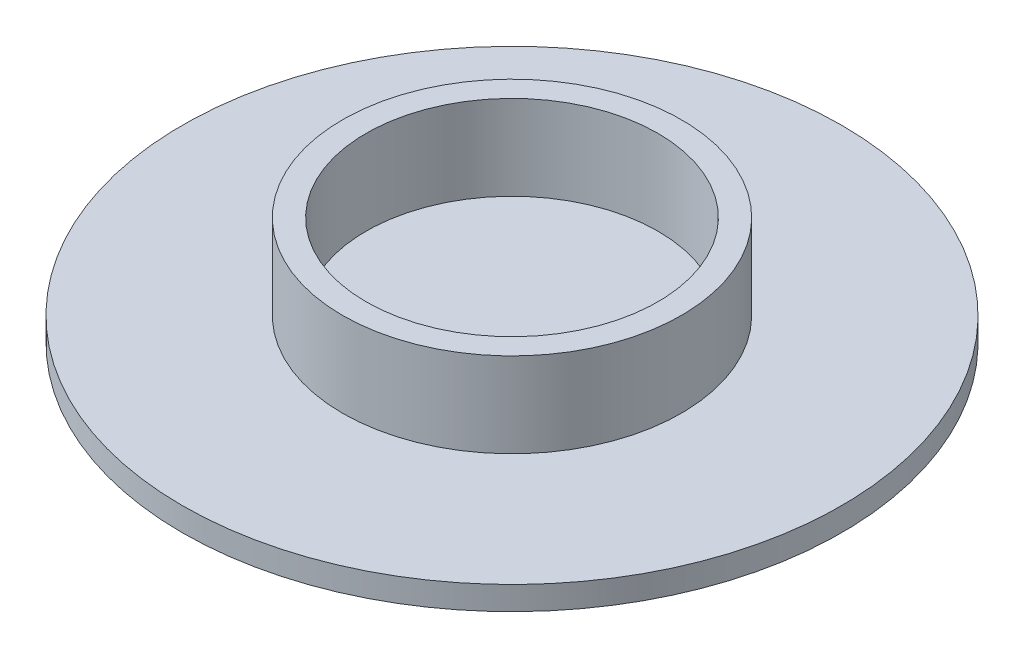
ISO-10303-21;
HEADER;
FILE_DESCRIPTION(('STEP AP214'),'2;1');
FILE_NAME('part.step','',(''),(''),'','','');
FILE_SCHEMA(('AUTOMOTIVE_DESIGN { 1 0 10303 214 1 1 1 1 }'));
ENDSEC;
DATA;
#1=APPLICATION_CONTEXT('core data for automotive mechanical design processes');
#2=APPLICATION_PROTOCOL_DEFINITION('international standard','automotive_design',2000,#1);
#3=PRODUCT_CONTEXT('',#1,'mechanical');
#4=PRODUCT('Part','Part','',(#3));
#5=PRODUCT_RELATED_PRODUCT_CATEGORY('part','',(#4));
#6=PRODUCT_DEFINITION_FORMATION('','',#4);
#7=PRODUCT_DEFINITION_CONTEXT('part definition',#1,'design');
#8=PRODUCT_DEFINITION('design','',#6,#7);
#9=PRODUCT_DEFINITION_SHAPE('','',#8);
#10=(LENGTH_UNIT() NAMED_UNIT(*) SI_UNIT(.MILLI.,.METRE.));
#11=(NAMED_UNIT(*) PLANE_ANGLE_UNIT() SI_UNIT($,.RADIAN.));
#12=(NAMED_UNIT(*) SI_UNIT($,.STERADIAN.) SOLID_ANGLE_UNIT());
#13=UNCERTAINTY_MEASURE_WITH_UNIT(LENGTH_MEASURE(1.E-05),#10,'distance_accuracy_value','');
#14=(GEOMETRIC_REPRESENTATION_CONTEXT(3) GLOBAL_UNCERTAINTY_ASSIGNED_CONTEXT((#13)) GLOBAL_UNIT_ASSIGNED_CONTEXT((#10,
#11,#12)) REPRESENTATION_CONTEXT('',''));
#15=CARTESIAN_POINT('',(0.,0.,0.));
#16=DIRECTION('',(0.,0.,1.));
#17=DIRECTION('',(1.,0.,0.));
#18=AXIS2_PLACEMENT_3D('',#15,#16,#17);
#19=CARTESIAN_POINT('',(0.,0.,0.));
#20=DIRECTION('',(0.,1.,0.));
#21=DIRECTION('',(0.,0.,1.));
#22=AXIS2_PLACEMENT_3D('',#19,#20,#21);
#23=PLANE('',#22);
#24=CARTESIAN_POINT('',(0.,0.,0.));
#25=DIRECTION('',(0.,1.,0.));
#26=DIRECTION('',(0.,0.,1.));
#27=AXIS2_PLACEMENT_3D('',#24,#25,#26);
#28=CIRCLE('',#27,70.);
#29=CARTESIAN_POINT('',(0.,0.,70.));
#30=VERTEX_POINT('',#29);
#31=EDGE_CURVE('E10',#30,#30,#28,.T.);
#32=ORIENTED_EDGE('',*,*,#31,.F.);
#33=EDGE_LOOP('',(#32));
#34=FACE_BOUND('',#33,.T.);
#35=ADVANCED_FACE('F31',(#34),#23,.F.);
#36=CARTESIAN_POINT('',(0.,4.99999999999999,0.));
#37=DIRECTION('',(0.,1.,0.));
#38=DIRECTION('',(0.,0.,1.));
#39=AXIS2_PLACEMENT_3D('',#36,#37,#38);
#40=CYLINDRICAL_SURFACE('',#39,70.);
#41=CARTESIAN_POINT('',(0.,5.,0.));
#42=DIRECTION('',(0.,1.,0.));
#43=DIRECTION('',(0.,0.,1.));
#44=AXIS2_PLACEMENT_3D('',#41,#42,#43);
#45=CIRCLE('',#44,70.);
#46=CARTESIAN_POINT('',(0.,5.,70.));
#47=VERTEX_POINT('',#46);
#48=EDGE_CURVE('E37',#47,#47,#45,.T.);
#49=ORIENTED_EDGE('',*,*,#48,.F.);
#50=EDGE_LOOP('',(#49));
#51=FACE_BOUND('',#50,.T.);
#52=ORIENTED_EDGE('',*,*,#31,.T.);
#53=EDGE_LOOP('',(#52));
#54=FACE_BOUND('',#53,.T.);
#55=ADVANCED_FACE('F79',(#51,#54),#40,.T.);
#56=CARTESIAN_POINT('',(0.,5.,-70.));
#57=DIRECTION('',(0.,-1.,0.));
#58=DIRECTION('',(0.,0.,-1.));
#59=AXIS2_PLACEMENT_3D('',#56,#57,#58);
#60=PLANE('',#59);
#61=CARTESIAN_POINT('',(0.,5.,0.));
#62=DIRECTION('',(0.,1.,0.));
#63=DIRECTION('',(0.,0.,1.));
#64=AXIS2_PLACEMENT_3D('',#61,#62,#63);
#65=CIRCLE('',#64,36.);
#66=CARTESIAN_POINT('',(0.,5.,36.));
#67=VERTEX_POINT('',#66);
#68=EDGE_CURVE('E41',#67,#67,#65,.T.);
#69=ORIENTED_EDGE('',*,*,#68,.F.);
#70=EDGE_LOOP('',(#69));
#71=FACE_BOUND('',#70,.T.);
#72=ORIENTED_EDGE('',*,*,#48,.T.);
#73=EDGE_LOOP('',(#72));
#74=FACE_BOUND('',#73,.T.);
#75=ADVANCED_FACE('F74',(#71,#74),#60,.F.);
#76=CARTESIAN_POINT('',(0.,4.99999999999999,0.));
#77=DIRECTION('',(0.,1.,0.));
#78=DIRECTION('',(0.,0.,1.));
#79=AXIS2_PLACEMENT_3D('',#76,#77,#78);
#80=CYLINDRICAL_SURFACE('',#79,36.);
#81=CARTESIAN_POINT('',(0.,23.,0.));
#82=DIRECTION('',(0.,1.,0.));
#83=DIRECTION('',(0.,0.,1.));
#84=AXIS2_PLACEMENT_3D('',#81,#82,#83);
#85=CIRCLE('',#84,36.);
#86=CARTESIAN_POINT('',(0.,23.,36.));
#87=VERTEX_POINT('',#86);
#88=EDGE_CURVE('E45',#87,#87,#85,.T.);
#89=ORIENTED_EDGE('',*,*,#88,.F.);
#90=EDGE_LOOP('',(#89));
#91=FACE_BOUND('',#90,.T.);
#92=ORIENTED_EDGE('',*,*,#68,.T.);
#93=EDGE_LOOP('',(#92));
#94=FACE_BOUND('',#93,.T.);
#95=ADVANCED_FACE('F68',(#91,#94),#80,.T.);
#96=CARTESIAN_POINT('',(0.,23.,-36.));
#97=DIRECTION('',(0.,-1.,0.));
#98=DIRECTION('',(0.,0.,-1.));
#99=AXIS2_PLACEMENT_3D('',#96,#97,#98);
#100=PLANE('',#99);
#101=CARTESIAN_POINT('',(0.,23.,0.));
#102=DIRECTION('',(0.,1.,0.));
#103=DIRECTION('',(0.,0.,1.));
#104=AXIS2_PLACEMENT_3D('',#101,#102,#103);
#105=CIRCLE('',#104,31.);
#106=CARTESIAN_POINT('',(0.,23.,31.));
#107=VERTEX_POINT('',#106);
#108=EDGE_CURVE('E50',#107,#107,#105,.T.);
#109=ORIENTED_EDGE('',*,*,#108,.F.);
#110=EDGE_LOOP('',(#109));
#111=FACE_BOUND('',#110,.T.);
#112=ORIENTED_EDGE('',*,*,#88,.T.);
#113=EDGE_LOOP('',(#112));
#114=FACE_BOUND('',#113,.T.);
#115=ADVANCED_FACE('F62',(#111,#114),#100,.F.);
#116=CARTESIAN_POINT('',(0.,4.99999999999999,0.));
#117=DIRECTION('',(0.,1.,0.));
#118=DIRECTION('',(0.,0.,1.));
#119=AXIS2_PLACEMENT_3D('',#116,#117,#118);
#120=CYLINDRICAL_SURFACE('',#119,31.);
#121=CARTESIAN_POINT('',(0.,5.,0.));
#122=DIRECTION('',(0.,1.,0.));
#123=DIRECTION('',(0.,0.,1.));
#124=AXIS2_PLACEMENT_3D('',#121,#122,#123);
#125=CIRCLE('',#124,31.);
#126=CARTESIAN_POINT('',(0.,5.,31.));
#127=VERTEX_POINT('',#126);
#128=EDGE_CURVE('E53',#127,#127,#125,.T.);
#129=ORIENTED_EDGE('',*,*,#128,.F.);
#130=EDGE_LOOP('',(#129));
#131=FACE_BOUND('',#130,.T.);
#132=ORIENTED_EDGE('',*,*,#108,.T.);
#133=EDGE_LOOP('',(#132));
#134=FACE_BOUND('',#133,.T.);
#135=ADVANCED_FACE('F59',(#131,#134),#120,.F.);
#136=CARTESIAN_POINT('',(0.,5.,-31.));
#137=DIRECTION('',(0.,-1.,0.));
#138=DIRECTION('',(0.,0.,-1.));
#139=AXIS2_PLACEMENT_3D('',#136,#137,#138);
#140=PLANE('',#139);
#141=ORIENTED_EDGE('',*,*,#128,.T.);
#142=EDGE_LOOP('',(#141));
#143=FACE_BOUND('',#142,.T.);
#144=ADVANCED_FACE('F57',(#143),#140,.F.);
#145=CLOSED_SHELL('',(#35,#55,#75,#95,#115,#135,#144));
#146=MANIFOLD_SOLID_BREP('B2',#145);
#147=ADVANCED_BREP_SHAPE_REPRESENTATION('',(#18,#146),#14);
#148=SHAPE_DEFINITION_REPRESENTATION(#9,#147);
ENDSEC;
END-ISO-10303-21;
